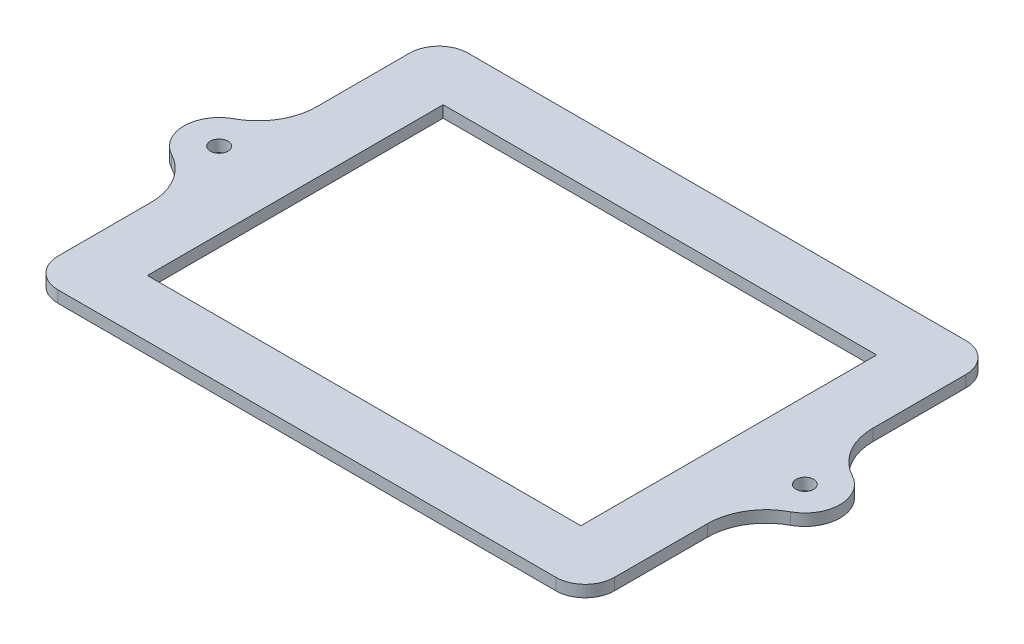
ISO-10303-21;
HEADER;
FILE_DESCRIPTION(('STEP AP214'),'2;1');
FILE_NAME('part.step','',(''),(''),'','','');
FILE_SCHEMA(('AUTOMOTIVE_DESIGN { 1 0 10303 214 1 1 1 1 }'));
ENDSEC;
DATA;
#1=APPLICATION_CONTEXT('core data for automotive mechanical design processes');
#2=APPLICATION_PROTOCOL_DEFINITION('international standard','automotive_design',2000,#1);
#3=PRODUCT_CONTEXT('',#1,'mechanical');
#4=PRODUCT('Part','Part','',(#3));
#5=PRODUCT_RELATED_PRODUCT_CATEGORY('part','',(#4));
#6=PRODUCT_DEFINITION_FORMATION('','',#4);
#7=PRODUCT_DEFINITION_CONTEXT('part definition',#1,'design');
#8=PRODUCT_DEFINITION('design','',#6,#7);
#9=PRODUCT_DEFINITION_SHAPE('','',#8);
#10=(LENGTH_UNIT() NAMED_UNIT(*) SI_UNIT(.MILLI.,.METRE.));
#11=(NAMED_UNIT(*) PLANE_ANGLE_UNIT() SI_UNIT($,.RADIAN.));
#12=(NAMED_UNIT(*) SI_UNIT($,.STERADIAN.) SOLID_ANGLE_UNIT());
#13=UNCERTAINTY_MEASURE_WITH_UNIT(LENGTH_MEASURE(1.E-05),#10,'distance_accuracy_value','');
#14=(GEOMETRIC_REPRESENTATION_CONTEXT(3) GLOBAL_UNCERTAINTY_ASSIGNED_CONTEXT((#13)) GLOBAL_UNIT_ASSIGNED_CONTEXT((#10,
#11,#12)) REPRESENTATION_CONTEXT('',''));
#15=CARTESIAN_POINT('',(0.,0.,0.));
#16=DIRECTION('',(0.,0.,1.));
#17=DIRECTION('',(1.,0.,0.));
#18=AXIS2_PLACEMENT_3D('',#15,#16,#17);
#19=CARTESIAN_POINT('',(-50.,2.,0.));
#20=DIRECTION('',(0.,1.,0.));
#21=DIRECTION('',(0.,0.,1.));
#22=AXIS2_PLACEMENT_3D('',#19,#20,#21);
#23=PLANE('',#22);
#24=CARTESIAN_POINT('',(-50.,2.,0.));
#25=DIRECTION('',(0.,1.,0.));
#26=DIRECTION('',(0.,0.,1.));
#27=AXIS2_PLACEMENT_3D('',#24,#25,#26);
#28=CIRCLE('',#27,1.5);
#29=CARTESIAN_POINT('',(-50.,2.,1.5));
#30=VERTEX_POINT('',#29);
#31=EDGE_CURVE('E204',#30,#30,#28,.T.);
#32=ORIENTED_EDGE('',*,*,#31,.F.);
#33=EDGE_LOOP('',(#32));
#34=FACE_BOUND('',#33,.T.);
#35=DIRECTION('',(1.,0.,0.));
#36=VECTOR('',#35,1.);
#37=CARTESIAN_POINT('',(-47.5,2.,35.));
#38=LINE('',#37,#36);
#39=CARTESIAN_POINT('',(-42.5,2.,35.));
#40=VERTEX_POINT('',#39);
#41=CARTESIAN_POINT('',(42.5,2.,35.));
#42=VERTEX_POINT('',#41);
#43=EDGE_CURVE('E224',#40,#42,#38,.T.);
#44=ORIENTED_EDGE('',*,*,#43,.T.);
#45=CARTESIAN_POINT('',(42.5,2.,30.));
#46=DIRECTION('',(0.,1.,0.));
#47=DIRECTION('',(0.,0.,1.));
#48=AXIS2_PLACEMENT_3D('',#45,#46,#47);
#49=CIRCLE('',#48,5.);
#50=CARTESIAN_POINT('',(47.5,2.,30.));
#51=VERTEX_POINT('',#50);
#52=EDGE_CURVE('E280',#42,#51,#49,.T.);
#53=ORIENTED_EDGE('',*,*,#52,.T.);
#54=DIRECTION('',(0.,0.,-1.));
#55=VECTOR('',#54,1.);
#56=CARTESIAN_POINT('',(47.5,2.,5.45435605731786));
#57=LINE('',#56,#55);
#58=CARTESIAN_POINT('',(47.5,2.,14.1332940251026));
#59=VERTEX_POINT('',#58);
#60=EDGE_CURVE('E227',#51,#59,#57,.T.);
#61=ORIENTED_EDGE('',*,*,#60,.T.);
#62=CARTESIAN_POINT('',(57.5,2.,14.1332940251026));
#63=DIRECTION('',(0.,1.,0.));
#64=DIRECTION('',(0.,0.,1.));
#65=AXIS2_PLACEMENT_3D('',#62,#63,#64);
#66=CIRCLE('',#65,10.);
#67=CARTESIAN_POINT('',(52.8125,2.,5.29998525941346));
#68=VERTEX_POINT('',#67);
#69=EDGE_CURVE('E11',#59,#68,#66,.F.);
#70=ORIENTED_EDGE('',*,*,#69,.T.);
#71=CARTESIAN_POINT('',(50.,2.,0.));
#72=DIRECTION('',(0.,1.,0.));
#73=DIRECTION('',(0.,0.,1.));
#74=AXIS2_PLACEMENT_3D('',#71,#72,#73);
#75=CIRCLE('',#74,6.);
#76=CARTESIAN_POINT('',(52.8125,2.,-5.29998525941346));
#77=VERTEX_POINT('',#76);
#78=EDGE_CURVE('E229',#68,#77,#75,.T.);
#79=ORIENTED_EDGE('',*,*,#78,.T.);
#80=CARTESIAN_POINT('',(57.5,2.,-14.1332940251026));
#81=DIRECTION('',(0.,1.,0.));
#82=DIRECTION('',(0.,0.,1.));
#83=AXIS2_PLACEMENT_3D('',#80,#81,#82);
#84=CIRCLE('',#83,10.);
#85=CARTESIAN_POINT('',(47.5,2.,-14.1332940251026));
#86=VERTEX_POINT('',#85);
#87=EDGE_CURVE('E325',#77,#86,#84,.F.);
#88=ORIENTED_EDGE('',*,*,#87,.T.);
#89=DIRECTION('',(0.,0.,-1.));
#90=VECTOR('',#89,1.);
#91=CARTESIAN_POINT('',(47.5,2.,-35.));
#92=LINE('',#91,#90);
#93=CARTESIAN_POINT('',(47.5,2.,-30.));
#94=VERTEX_POINT('',#93);
#95=EDGE_CURVE('E232',#86,#94,#92,.T.);
#96=ORIENTED_EDGE('',*,*,#95,.T.);
#97=CARTESIAN_POINT('',(42.5,2.,-30.));
#98=DIRECTION('',(0.,1.,0.));
#99=DIRECTION('',(0.,0.,1.));
#100=AXIS2_PLACEMENT_3D('',#97,#98,#99);
#101=CIRCLE('',#100,5.);
#102=CARTESIAN_POINT('',(42.5,2.,-35.));
#103=VERTEX_POINT('',#102);
#104=EDGE_CURVE('E274',#94,#103,#101,.T.);
#105=ORIENTED_EDGE('',*,*,#104,.T.);
#106=DIRECTION('',(-1.,0.,0.));
#107=VECTOR('',#106,1.);
#108=CARTESIAN_POINT('',(-47.5,2.,-35.));
#109=LINE('',#108,#107);
#110=CARTESIAN_POINT('',(-42.5,2.,-35.));
#111=VERTEX_POINT('',#110);
#112=EDGE_CURVE('E234',#103,#111,#109,.T.);
#113=ORIENTED_EDGE('',*,*,#112,.T.);
#114=CARTESIAN_POINT('',(-42.5,2.,-30.));
#115=DIRECTION('',(0.,1.,0.));
#116=DIRECTION('',(0.,0.,1.));
#117=AXIS2_PLACEMENT_3D('',#114,#115,#116);
#118=CIRCLE('',#117,5.);
#119=CARTESIAN_POINT('',(-47.5,2.,-30.));
#120=VERTEX_POINT('',#119);
#121=EDGE_CURVE('E276',#111,#120,#118,.T.);
#122=ORIENTED_EDGE('',*,*,#121,.T.);
#123=DIRECTION('',(0.,0.,1.));
#124=VECTOR('',#123,1.);
#125=CARTESIAN_POINT('',(-47.5,2.,-35.));
#126=LINE('',#125,#124);
#127=CARTESIAN_POINT('',(-47.5,2.,-14.1332940251026));
#128=VERTEX_POINT('',#127);
#129=EDGE_CURVE('E215',#120,#128,#126,.T.);
#130=ORIENTED_EDGE('',*,*,#129,.T.);
#131=CARTESIAN_POINT('',(-57.5,2.,-14.1332940251026));
#132=DIRECTION('',(0.,1.,0.));
#133=DIRECTION('',(0.,0.,1.));
#134=AXIS2_PLACEMENT_3D('',#131,#132,#133);
#135=CIRCLE('',#134,10.);
#136=CARTESIAN_POINT('',(-52.8125,2.,-5.29998525941346));
#137=VERTEX_POINT('',#136);
#138=EDGE_CURVE('E317',#128,#137,#135,.F.);
#139=ORIENTED_EDGE('',*,*,#138,.T.);
#140=CARTESIAN_POINT('',(-50.,2.,0.));
#141=DIRECTION('',(0.,1.,0.));
#142=DIRECTION('',(0.,0.,1.));
#143=AXIS2_PLACEMENT_3D('',#140,#141,#142);
#144=CIRCLE('',#143,6.);
#145=CARTESIAN_POINT('',(-52.8125,2.,5.29998525941346));
#146=VERTEX_POINT('',#145);
#147=EDGE_CURVE('E218',#137,#146,#144,.T.);
#148=ORIENTED_EDGE('',*,*,#147,.T.);
#149=CARTESIAN_POINT('',(-57.5,2.,14.1332940251026));
#150=DIRECTION('',(0.,1.,0.));
#151=DIRECTION('',(0.,0.,1.));
#152=AXIS2_PLACEMENT_3D('',#149,#150,#151);
#153=CIRCLE('',#152,10.);
#154=CARTESIAN_POINT('',(-47.5,2.,14.1332940251026));
#155=VERTEX_POINT('',#154);
#156=EDGE_CURVE('E321',#146,#155,#153,.F.);
#157=ORIENTED_EDGE('',*,*,#156,.T.);
#158=DIRECTION('',(0.,0.,1.));
#159=VECTOR('',#158,1.);
#160=CARTESIAN_POINT('',(-47.5,2.,5.45435605731786));
#161=LINE('',#160,#159);
#162=CARTESIAN_POINT('',(-47.5,2.,30.));
#163=VERTEX_POINT('',#162);
#164=EDGE_CURVE('E222',#155,#163,#161,.T.);
#165=ORIENTED_EDGE('',*,*,#164,.T.);
#166=CARTESIAN_POINT('',(-42.5,2.,30.));
#167=DIRECTION('',(0.,1.,0.));
#168=DIRECTION('',(0.,0.,1.));
#169=AXIS2_PLACEMENT_3D('',#166,#167,#168);
#170=CIRCLE('',#169,5.);
#171=EDGE_CURVE('E278',#163,#40,#170,.T.);
#172=ORIENTED_EDGE('',*,*,#171,.T.);
#173=EDGE_LOOP('',(#44,#53,#61,#70,#79,#88,#96,#105,#113,#122,#130,#139,#148,#157,#165,#172));
#174=FACE_BOUND('',#173,.T.);
#175=DIRECTION('',(1.,0.,0.));
#176=VECTOR('',#175,1.);
#177=CARTESIAN_POINT('',(-37.,2.,25.25));
#178=LINE('',#177,#176);
#179=CARTESIAN_POINT('',(-37.,2.,25.25));
#180=VERTEX_POINT('',#179);
#181=CARTESIAN_POINT('',(37.,2.,25.25));
#182=VERTEX_POINT('',#181);
#183=EDGE_CURVE('E181',#180,#182,#178,.T.);
#184=ORIENTED_EDGE('',*,*,#183,.F.);
#185=DIRECTION('',(0.,0.,1.));
#186=VECTOR('',#185,1.);
#187=CARTESIAN_POINT('',(-37.,2.,-25.25));
#188=LINE('',#187,#186);
#189=CARTESIAN_POINT('',(-37.,2.,-25.25));
#190=VERTEX_POINT('',#189);
#191=EDGE_CURVE('E171',#190,#180,#188,.T.);
#192=ORIENTED_EDGE('',*,*,#191,.F.);
#193=DIRECTION('',(-1.,0.,0.));
#194=VECTOR('',#193,1.);
#195=CARTESIAN_POINT('',(-37.,2.,-25.25));
#196=LINE('',#195,#194);
#197=CARTESIAN_POINT('',(37.,2.,-25.25));
#198=VERTEX_POINT('',#197);
#199=EDGE_CURVE('E197',#198,#190,#196,.T.);
#200=ORIENTED_EDGE('',*,*,#199,.F.);
#201=DIRECTION('',(0.,0.,-1.));
#202=VECTOR('',#201,1.);
#203=CARTESIAN_POINT('',(37.,2.,-25.25));
#204=LINE('',#203,#202);
#205=EDGE_CURVE('E195',#182,#198,#204,.T.);
#206=ORIENTED_EDGE('',*,*,#205,.F.);
#207=EDGE_LOOP('',(#184,#192,#200,#206));
#208=FACE_BOUND('',#207,.T.);
#209=CARTESIAN_POINT('',(50.,2.,0.));
#210=DIRECTION('',(0.,1.,0.));
#211=DIRECTION('',(0.,0.,1.));
#212=AXIS2_PLACEMENT_3D('',#209,#210,#211);
#213=CIRCLE('',#212,1.5);
#214=CARTESIAN_POINT('',(50.,2.,1.5));
#215=VERTEX_POINT('',#214);
#216=EDGE_CURVE('E598',#215,#215,#213,.T.);
#217=ORIENTED_EDGE('',*,*,#216,.F.);
#218=EDGE_LOOP('',(#217));
#219=FACE_BOUND('',#218,.T.);
#220=ADVANCED_FACE('F33',(#34,#174,#208,#219),#23,.T.);
#221=CARTESIAN_POINT('',(-50.,0.,0.));
#222=DIRECTION('',(0.,1.,0.));
#223=DIRECTION('',(0.,0.,1.));
#224=AXIS2_PLACEMENT_3D('',#221,#222,#223);
#225=PLANE('',#224);
#226=DIRECTION('',(0.,0.,-1.));
#227=VECTOR('',#226,1.);
#228=CARTESIAN_POINT('',(47.5,0.,5.45435605731786));
#229=LINE('',#228,#227);
#230=CARTESIAN_POINT('',(47.5,0.,30.));
#231=VERTEX_POINT('',#230);
#232=CARTESIAN_POINT('',(47.5,0.,14.1332940251026));
#233=VERTEX_POINT('',#232);
#234=EDGE_CURVE('E248',#231,#233,#229,.T.);
#235=ORIENTED_EDGE('',*,*,#234,.F.);
#236=CARTESIAN_POINT('',(42.5,0.,30.));
#237=DIRECTION('',(0.,1.,0.));
#238=DIRECTION('',(0.,0.,1.));
#239=AXIS2_PLACEMENT_3D('',#236,#237,#238);
#240=CIRCLE('',#239,5.);
#241=CARTESIAN_POINT('',(42.5,0.,35.));
#242=VERTEX_POINT('',#241);
#243=EDGE_CURVE('E267',#231,#242,#240,.F.);
#244=ORIENTED_EDGE('',*,*,#243,.T.);
#245=DIRECTION('',(1.,0.,0.));
#246=VECTOR('',#245,1.);
#247=CARTESIAN_POINT('',(-47.5,0.,35.));
#248=LINE('',#247,#246);
#249=CARTESIAN_POINT('',(-42.5,0.,35.));
#250=VERTEX_POINT('',#249);
#251=EDGE_CURVE('E245',#250,#242,#248,.T.);
#252=ORIENTED_EDGE('',*,*,#251,.F.);
#253=CARTESIAN_POINT('',(-42.5,0.,30.));
#254=DIRECTION('',(0.,1.,0.));
#255=DIRECTION('',(0.,0.,1.));
#256=AXIS2_PLACEMENT_3D('',#253,#254,#255);
#257=CIRCLE('',#256,5.);
#258=CARTESIAN_POINT('',(-47.5,0.,30.));
#259=VERTEX_POINT('',#258);
#260=EDGE_CURVE('E264',#250,#259,#257,.F.);
#261=ORIENTED_EDGE('',*,*,#260,.T.);
#262=DIRECTION('',(0.,0.,1.));
#263=VECTOR('',#262,1.);
#264=CARTESIAN_POINT('',(-47.5,0.,5.45435605731786));
#265=LINE('',#264,#263);
#266=CARTESIAN_POINT('',(-47.5,0.,14.1332940251026));
#267=VERTEX_POINT('',#266);
#268=EDGE_CURVE('E243',#267,#259,#265,.T.);
#269=ORIENTED_EDGE('',*,*,#268,.F.);
#270=CARTESIAN_POINT('',(-57.5,0.,14.1332940251026));
#271=DIRECTION('',(0.,1.,0.));
#272=DIRECTION('',(0.,0.,1.));
#273=AXIS2_PLACEMENT_3D('',#270,#271,#272);
#274=CIRCLE('',#273,10.);
#275=CARTESIAN_POINT('',(-52.8125,0.,5.29998525941346));
#276=VERTEX_POINT('',#275);
#277=EDGE_CURVE('E319',#267,#276,#274,.T.);
#278=ORIENTED_EDGE('',*,*,#277,.T.);
#279=CARTESIAN_POINT('',(-50.,0.,0.));
#280=DIRECTION('',(0.,1.,0.));
#281=DIRECTION('',(0.,0.,1.));
#282=AXIS2_PLACEMENT_3D('',#279,#280,#281);
#283=CIRCLE('',#282,6.);
#284=CARTESIAN_POINT('',(-52.8125,0.,-5.29998525941346));
#285=VERTEX_POINT('',#284);
#286=EDGE_CURVE('E240',#285,#276,#283,.T.);
#287=ORIENTED_EDGE('',*,*,#286,.F.);
#288=CARTESIAN_POINT('',(-57.5,0.,-14.1332940251026));
#289=DIRECTION('',(0.,1.,0.));
#290=DIRECTION('',(0.,0.,1.));
#291=AXIS2_PLACEMENT_3D('',#288,#289,#290);
#292=CIRCLE('',#291,10.);
#293=CARTESIAN_POINT('',(-47.5,0.,-14.1332940251026));
#294=VERTEX_POINT('',#293);
#295=EDGE_CURVE('E315',#285,#294,#292,.T.);
#296=ORIENTED_EDGE('',*,*,#295,.T.);
#297=DIRECTION('',(0.,0.,1.));
#298=VECTOR('',#297,1.);
#299=CARTESIAN_POINT('',(-47.5,0.,-35.));
#300=LINE('',#299,#298);
#301=CARTESIAN_POINT('',(-47.5,0.,-30.));
#302=VERTEX_POINT('',#301);
#303=EDGE_CURVE('E189',#302,#294,#300,.T.);
#304=ORIENTED_EDGE('',*,*,#303,.F.);
#305=CARTESIAN_POINT('',(-42.5,0.,-30.));
#306=DIRECTION('',(0.,1.,0.));
#307=DIRECTION('',(0.,0.,1.));
#308=AXIS2_PLACEMENT_3D('',#305,#306,#307);
#309=CIRCLE('',#308,5.);
#310=CARTESIAN_POINT('',(-42.5,0.,-35.));
#311=VERTEX_POINT('',#310);
#312=EDGE_CURVE('E262',#302,#311,#309,.F.);
#313=ORIENTED_EDGE('',*,*,#312,.T.);
#314=DIRECTION('',(-1.,0.,0.));
#315=VECTOR('',#314,1.);
#316=CARTESIAN_POINT('',(-47.5,0.,-35.));
#317=LINE('',#316,#315);
#318=CARTESIAN_POINT('',(42.5,0.,-35.));
#319=VERTEX_POINT('',#318);
#320=EDGE_CURVE('E219',#319,#311,#317,.T.);
#321=ORIENTED_EDGE('',*,*,#320,.F.);
#322=CARTESIAN_POINT('',(42.5,0.,-30.));
#323=DIRECTION('',(0.,1.,0.));
#324=DIRECTION('',(0.,0.,1.));
#325=AXIS2_PLACEMENT_3D('',#322,#323,#324);
#326=CIRCLE('',#325,5.);
#327=CARTESIAN_POINT('',(47.5,0.,-30.));
#328=VERTEX_POINT('',#327);
#329=EDGE_CURVE('E259',#319,#328,#326,.F.);
#330=ORIENTED_EDGE('',*,*,#329,.T.);
#331=DIRECTION('',(0.,0.,-1.));
#332=VECTOR('',#331,1.);
#333=CARTESIAN_POINT('',(47.5,0.,-35.));
#334=LINE('',#333,#332);
#335=CARTESIAN_POINT('',(47.5,0.,-14.1332940251026));
#336=VERTEX_POINT('',#335);
#337=EDGE_CURVE('E253',#336,#328,#334,.T.);
#338=ORIENTED_EDGE('',*,*,#337,.F.);
#339=CARTESIAN_POINT('',(57.5,0.,-14.1332940251026));
#340=DIRECTION('',(0.,1.,0.));
#341=DIRECTION('',(0.,0.,1.));
#342=AXIS2_PLACEMENT_3D('',#339,#340,#341);
#343=CIRCLE('',#342,10.);
#344=CARTESIAN_POINT('',(52.8125,0.,-5.29998525941346));
#345=VERTEX_POINT('',#344);
#346=EDGE_CURVE('E323',#336,#345,#343,.T.);
#347=ORIENTED_EDGE('',*,*,#346,.T.);
#348=CARTESIAN_POINT('',(50.,0.,0.));
#349=DIRECTION('',(0.,1.,0.));
#350=DIRECTION('',(0.,0.,1.));
#351=AXIS2_PLACEMENT_3D('',#348,#349,#350);
#352=CIRCLE('',#351,6.);
#353=CARTESIAN_POINT('',(52.8125,0.,5.29998525941346));
#354=VERTEX_POINT('',#353);
#355=EDGE_CURVE('E250',#354,#345,#352,.T.);
#356=ORIENTED_EDGE('',*,*,#355,.F.);
#357=CARTESIAN_POINT('',(57.5,0.,14.1332940251026));
#358=DIRECTION('',(0.,1.,0.));
#359=DIRECTION('',(0.,0.,1.));
#360=AXIS2_PLACEMENT_3D('',#357,#358,#359);
#361=CIRCLE('',#360,10.);
#362=EDGE_CURVE('E41',#354,#233,#361,.T.);
#363=ORIENTED_EDGE('',*,*,#362,.T.);
#364=EDGE_LOOP('',(#235,#244,#252,#261,#269,#278,#287,#296,#304,#313,#321,#330,#338,#347,#356,#363));
#365=FACE_BOUND('',#364,.T.);
#366=DIRECTION('',(0.,0.,1.));
#367=VECTOR('',#366,1.);
#368=CARTESIAN_POINT('',(-37.,0.,-25.25));
#369=LINE('',#368,#367);
#370=CARTESIAN_POINT('',(-37.,0.,-25.25));
#371=VERTEX_POINT('',#370);
#372=CARTESIAN_POINT('',(-37.,0.,25.25));
#373=VERTEX_POINT('',#372);
#374=EDGE_CURVE('E202',#371,#373,#369,.T.);
#375=ORIENTED_EDGE('',*,*,#374,.T.);
#376=DIRECTION('',(1.,0.,0.));
#377=VECTOR('',#376,1.);
#378=CARTESIAN_POINT('',(-37.,0.,25.25));
#379=LINE('',#378,#377);
#380=CARTESIAN_POINT('',(37.,0.,25.25));
#381=VERTEX_POINT('',#380);
#382=EDGE_CURVE('E188',#373,#381,#379,.T.);
#383=ORIENTED_EDGE('',*,*,#382,.T.);
#384=DIRECTION('',(0.,0.,-1.));
#385=VECTOR('',#384,1.);
#386=CARTESIAN_POINT('',(37.,0.,-25.25));
#387=LINE('',#386,#385);
#388=CARTESIAN_POINT('',(37.,0.,-25.25));
#389=VERTEX_POINT('',#388);
#390=EDGE_CURVE('E206',#381,#389,#387,.T.);
#391=ORIENTED_EDGE('',*,*,#390,.T.);
#392=DIRECTION('',(-1.,0.,0.));
#393=VECTOR('',#392,1.);
#394=CARTESIAN_POINT('',(-37.,0.,-25.25));
#395=LINE('',#394,#393);
#396=EDGE_CURVE('E182',#389,#371,#395,.T.);
#397=ORIENTED_EDGE('',*,*,#396,.T.);
#398=EDGE_LOOP('',(#375,#383,#391,#397));
#399=FACE_BOUND('',#398,.T.);
#400=CARTESIAN_POINT('',(-50.,0.,0.));
#401=DIRECTION('',(0.,1.,0.));
#402=DIRECTION('',(0.,0.,1.));
#403=AXIS2_PLACEMENT_3D('',#400,#401,#402);
#404=CIRCLE('',#403,1.5);
#405=CARTESIAN_POINT('',(-50.,0.,1.5));
#406=VERTEX_POINT('',#405);
#407=EDGE_CURVE('E604',#406,#406,#404,.T.);
#408=ORIENTED_EDGE('',*,*,#407,.T.);
#409=EDGE_LOOP('',(#408));
#410=FACE_BOUND('',#409,.T.);
#411=CARTESIAN_POINT('',(50.,0.,0.));
#412=DIRECTION('',(0.,1.,0.));
#413=DIRECTION('',(0.,0.,1.));
#414=AXIS2_PLACEMENT_3D('',#411,#412,#413);
#415=CIRCLE('',#414,1.5);
#416=CARTESIAN_POINT('',(50.,0.,1.5));
#417=VERTEX_POINT('',#416);
#418=EDGE_CURVE('E601',#417,#417,#415,.T.);
#419=ORIENTED_EDGE('',*,*,#418,.T.);
#420=EDGE_LOOP('',(#419));
#421=FACE_BOUND('',#420,.T.);
#422=ADVANCED_FACE('F339',(#365,#399,#410,#421),#225,.F.);
#423=CARTESIAN_POINT('',(-47.5,2.,-35.));
#424=DIRECTION('',(1.,0.,0.));
#425=DIRECTION('',(0.,0.,-1.));
#426=AXIS2_PLACEMENT_3D('',#423,#424,#425);
#427=PLANE('',#426);
#428=ORIENTED_EDGE('',*,*,#303,.T.);
#429=DIRECTION('',(0.,1.,0.));
#430=VECTOR('',#429,1.);
#431=CARTESIAN_POINT('',(-47.5,2.,-14.1332940251026));
#432=LINE('',#431,#430);
#433=EDGE_CURVE('E301',#294,#128,#432,.T.);
#434=ORIENTED_EDGE('',*,*,#433,.T.);
#435=ORIENTED_EDGE('',*,*,#129,.F.);
#436=DIRECTION('',(0.,-1.,0.));
#437=VECTOR('',#436,1.);
#438=CARTESIAN_POINT('',(-47.5,2.,-30.));
#439=LINE('',#438,#437);
#440=EDGE_CURVE('E285',#120,#302,#439,.T.);
#441=ORIENTED_EDGE('',*,*,#440,.T.);
#442=EDGE_LOOP('',(#428,#434,#435,#441));
#443=FACE_BOUND('',#442,.T.);
#444=ADVANCED_FACE('F382',(#443),#427,.F.);
#445=CARTESIAN_POINT('',(-50.,2.,0.));
#446=DIRECTION('',(0.,-1.,0.));
#447=DIRECTION('',(0.,0.,-1.));
#448=AXIS2_PLACEMENT_3D('',#445,#446,#447);
#449=CYLINDRICAL_SURFACE('',#448,6.);
#450=ORIENTED_EDGE('',*,*,#147,.F.);
#451=DIRECTION('',(0.,-1.,0.));
#452=VECTOR('',#451,1.);
#453=CARTESIAN_POINT('',(-52.8125,2.,-5.29998525941346));
#454=LINE('',#453,#452);
#455=EDGE_CURVE('E298',#137,#285,#454,.T.);
#456=ORIENTED_EDGE('',*,*,#455,.T.);
#457=ORIENTED_EDGE('',*,*,#286,.T.);
#458=DIRECTION('',(0.,-1.,0.));
#459=VECTOR('',#458,1.);
#460=CARTESIAN_POINT('',(-52.8125,2.,5.29998525941346));
#461=LINE('',#460,#459);
#462=EDGE_CURVE('E296',#276,#146,#461,.F.);
#463=ORIENTED_EDGE('',*,*,#462,.T.);
#464=EDGE_LOOP('',(#450,#456,#457,#463));
#465=FACE_BOUND('',#464,.T.);
#466=ADVANCED_FACE('F373',(#465),#449,.T.);
#467=CARTESIAN_POINT('',(-47.5,2.,5.45435605731786));
#468=DIRECTION('',(1.,0.,0.));
#469=DIRECTION('',(0.,0.,-1.));
#470=AXIS2_PLACEMENT_3D('',#467,#468,#469);
#471=PLANE('',#470);
#472=ORIENTED_EDGE('',*,*,#164,.F.);
#473=DIRECTION('',(0.,1.,0.));
#474=VECTOR('',#473,1.);
#475=CARTESIAN_POINT('',(-47.5,0.,14.1332940251026));
#476=LINE('',#475,#474);
#477=EDGE_CURVE('E303',#155,#267,#476,.F.);
#478=ORIENTED_EDGE('',*,*,#477,.T.);
#479=ORIENTED_EDGE('',*,*,#268,.T.);
#480=DIRECTION('',(0.,-1.,0.));
#481=VECTOR('',#480,1.);
#482=CARTESIAN_POINT('',(-47.5,2.,30.));
#483=LINE('',#482,#481);
#484=EDGE_CURVE('E282',#259,#163,#483,.F.);
#485=ORIENTED_EDGE('',*,*,#484,.T.);
#486=EDGE_LOOP('',(#472,#478,#479,#485));
#487=FACE_BOUND('',#486,.T.);
#488=ADVANCED_FACE('F365',(#487),#471,.F.);
#489=CARTESIAN_POINT('',(-47.5,2.,35.));
#490=DIRECTION('',(0.,0.,-1.));
#491=DIRECTION('',(-1.,0.,0.));
#492=AXIS2_PLACEMENT_3D('',#489,#490,#491);
#493=PLANE('',#492);
#494=ORIENTED_EDGE('',*,*,#251,.T.);
#495=DIRECTION('',(0.,-1.,0.));
#496=VECTOR('',#495,1.);
#497=CARTESIAN_POINT('',(42.5,2.,35.));
#498=LINE('',#497,#496);
#499=EDGE_CURVE('E272',#242,#42,#498,.F.);
#500=ORIENTED_EDGE('',*,*,#499,.T.);
#501=ORIENTED_EDGE('',*,*,#43,.F.);
#502=DIRECTION('',(0.,-1.,0.));
#503=VECTOR('',#502,1.);
#504=CARTESIAN_POINT('',(-42.5,2.,35.));
#505=LINE('',#504,#503);
#506=EDGE_CURVE('E269',#40,#250,#505,.T.);
#507=ORIENTED_EDGE('',*,*,#506,.T.);
#508=EDGE_LOOP('',(#494,#500,#501,#507));
#509=FACE_BOUND('',#508,.T.);
#510=ADVANCED_FACE('F354',(#509),#493,.F.);
#511=CARTESIAN_POINT('',(47.5,2.,5.45435605731786));
#512=DIRECTION('',(-1.,0.,0.));
#513=DIRECTION('',(0.,0.,1.));
#514=AXIS2_PLACEMENT_3D('',#511,#512,#513);
#515=PLANE('',#514);
#516=ORIENTED_EDGE('',*,*,#234,.T.);
#517=DIRECTION('',(0.,1.,0.));
#518=VECTOR('',#517,1.);
#519=CARTESIAN_POINT('',(47.5,2.,14.1332940251026));
#520=LINE('',#519,#518);
#521=EDGE_CURVE('E54',#233,#59,#520,.T.);
#522=ORIENTED_EDGE('',*,*,#521,.T.);
#523=ORIENTED_EDGE('',*,*,#60,.F.);
#524=DIRECTION('',(0.,-1.,0.));
#525=VECTOR('',#524,1.);
#526=CARTESIAN_POINT('',(47.5,2.,30.));
#527=LINE('',#526,#525);
#528=EDGE_CURVE('E237',#51,#231,#527,.T.);
#529=ORIENTED_EDGE('',*,*,#528,.T.);
#530=EDGE_LOOP('',(#516,#522,#523,#529));
#531=FACE_BOUND('',#530,.T.);
#532=ADVANCED_FACE('F348',(#531),#515,.F.);
#533=CARTESIAN_POINT('',(50.,2.,0.));
#534=DIRECTION('',(0.,-1.,0.));
#535=DIRECTION('',(0.,0.,-1.));
#536=AXIS2_PLACEMENT_3D('',#533,#534,#535);
#537=CYLINDRICAL_SURFACE('',#536,6.);
#538=ORIENTED_EDGE('',*,*,#355,.T.);
#539=DIRECTION('',(0.,-1.,0.));
#540=VECTOR('',#539,1.);
#541=CARTESIAN_POINT('',(52.8125,2.,-5.29998525941346));
#542=LINE('',#541,#540);
#543=EDGE_CURVE('E312',#345,#77,#542,.F.);
#544=ORIENTED_EDGE('',*,*,#543,.T.);
#545=ORIENTED_EDGE('',*,*,#78,.F.);
#546=DIRECTION('',(0.,-1.,0.));
#547=VECTOR('',#546,1.);
#548=CARTESIAN_POINT('',(52.8125,2.,5.29998525941346));
#549=LINE('',#548,#547);
#550=EDGE_CURVE('E309',#68,#354,#549,.T.);
#551=ORIENTED_EDGE('',*,*,#550,.T.);
#552=EDGE_LOOP('',(#538,#544,#545,#551));
#553=FACE_BOUND('',#552,.T.);
#554=ADVANCED_FACE('F342',(#553),#537,.T.);
#555=CARTESIAN_POINT('',(47.5,2.,-35.));
#556=DIRECTION('',(-1.,0.,0.));
#557=DIRECTION('',(0.,0.,1.));
#558=AXIS2_PLACEMENT_3D('',#555,#556,#557);
#559=PLANE('',#558);
#560=ORIENTED_EDGE('',*,*,#95,.F.);
#561=DIRECTION('',(0.,1.,0.));
#562=VECTOR('',#561,1.);
#563=CARTESIAN_POINT('',(47.5,0.,-14.1332940251026));
#564=LINE('',#563,#562);
#565=EDGE_CURVE('E306',#86,#336,#564,.F.);
#566=ORIENTED_EDGE('',*,*,#565,.T.);
#567=ORIENTED_EDGE('',*,*,#337,.T.);
#568=DIRECTION('',(0.,-1.,0.));
#569=VECTOR('',#568,1.);
#570=CARTESIAN_POINT('',(47.5,2.,-30.));
#571=LINE('',#570,#569);
#572=EDGE_CURVE('E293',#328,#94,#571,.F.);
#573=ORIENTED_EDGE('',*,*,#572,.T.);
#574=EDGE_LOOP('',(#560,#566,#567,#573));
#575=FACE_BOUND('',#574,.T.);
#576=ADVANCED_FACE('F334',(#575),#559,.F.);
#577=CARTESIAN_POINT('',(-47.5,2.,-35.));
#578=DIRECTION('',(0.,0.,1.));
#579=DIRECTION('',(1.,0.,0.));
#580=AXIS2_PLACEMENT_3D('',#577,#578,#579);
#581=PLANE('',#580);
#582=ORIENTED_EDGE('',*,*,#320,.T.);
#583=DIRECTION('',(0.,-1.,0.));
#584=VECTOR('',#583,1.);
#585=CARTESIAN_POINT('',(-42.5,2.,-35.));
#586=LINE('',#585,#584);
#587=EDGE_CURVE('E291',#311,#111,#586,.F.);
#588=ORIENTED_EDGE('',*,*,#587,.T.);
#589=ORIENTED_EDGE('',*,*,#112,.F.);
#590=DIRECTION('',(0.,-1.,0.));
#591=VECTOR('',#590,1.);
#592=CARTESIAN_POINT('',(42.5,2.,-35.));
#593=LINE('',#592,#591);
#594=EDGE_CURVE('E288',#103,#319,#593,.T.);
#595=ORIENTED_EDGE('',*,*,#594,.T.);
#596=EDGE_LOOP('',(#582,#588,#589,#595));
#597=FACE_BOUND('',#596,.T.);
#598=ADVANCED_FACE('F390',(#597),#581,.F.);
#599=CARTESIAN_POINT('',(-37.,2.,-25.25));
#600=DIRECTION('',(1.,0.,0.));
#601=DIRECTION('',(0.,0.,-1.));
#602=AXIS2_PLACEMENT_3D('',#599,#600,#601);
#603=PLANE('',#602);
#604=ORIENTED_EDGE('',*,*,#374,.F.);
#605=DIRECTION('',(0.,-1.,0.));
#606=VECTOR('',#605,1.);
#607=CARTESIAN_POINT('',(-37.,2.,-25.25));
#608=LINE('',#607,#606);
#609=EDGE_CURVE('E177',#190,#371,#608,.T.);
#610=ORIENTED_EDGE('',*,*,#609,.F.);
#611=ORIENTED_EDGE('',*,*,#191,.T.);
#612=DIRECTION('',(0.,-1.,0.));
#613=VECTOR('',#612,1.);
#614=CARTESIAN_POINT('',(-37.,2.,25.25));
#615=LINE('',#614,#613);
#616=EDGE_CURVE('E174',#180,#373,#615,.T.);
#617=ORIENTED_EDGE('',*,*,#616,.T.);
#618=EDGE_LOOP('',(#604,#610,#611,#617));
#619=FACE_BOUND('',#618,.T.);
#620=ADVANCED_FACE('F173',(#619),#603,.T.);
#621=CARTESIAN_POINT('',(-37.,2.,25.25));
#622=DIRECTION('',(0.,0.,-1.));
#623=DIRECTION('',(-1.,0.,0.));
#624=AXIS2_PLACEMENT_3D('',#621,#622,#623);
#625=PLANE('',#624);
#626=ORIENTED_EDGE('',*,*,#382,.F.);
#627=ORIENTED_EDGE('',*,*,#616,.F.);
#628=ORIENTED_EDGE('',*,*,#183,.T.);
#629=DIRECTION('',(0.,-1.,0.));
#630=VECTOR('',#629,1.);
#631=CARTESIAN_POINT('',(37.,2.,25.25));
#632=LINE('',#631,#630);
#633=EDGE_CURVE('E190',#182,#381,#632,.T.);
#634=ORIENTED_EDGE('',*,*,#633,.T.);
#635=EDGE_LOOP('',(#626,#627,#628,#634));
#636=FACE_BOUND('',#635,.T.);
#637=ADVANCED_FACE('F185',(#636),#625,.T.);
#638=CARTESIAN_POINT('',(37.,2.,-25.25));
#639=DIRECTION('',(-1.,0.,0.));
#640=DIRECTION('',(0.,0.,1.));
#641=AXIS2_PLACEMENT_3D('',#638,#639,#640);
#642=PLANE('',#641);
#643=ORIENTED_EDGE('',*,*,#390,.F.);
#644=ORIENTED_EDGE('',*,*,#633,.F.);
#645=ORIENTED_EDGE('',*,*,#205,.T.);
#646=DIRECTION('',(0.,-1.,0.));
#647=VECTOR('',#646,1.);
#648=CARTESIAN_POINT('',(37.,2.,-25.25));
#649=LINE('',#648,#647);
#650=EDGE_CURVE('E212',#198,#389,#649,.T.);
#651=ORIENTED_EDGE('',*,*,#650,.T.);
#652=EDGE_LOOP('',(#643,#644,#645,#651));
#653=FACE_BOUND('',#652,.T.);
#654=ADVANCED_FACE('F540',(#653),#642,.T.);
#655=CARTESIAN_POINT('',(-37.,2.,-25.25));
#656=DIRECTION('',(0.,0.,1.));
#657=DIRECTION('',(1.,0.,0.));
#658=AXIS2_PLACEMENT_3D('',#655,#656,#657);
#659=PLANE('',#658);
#660=ORIENTED_EDGE('',*,*,#396,.F.);
#661=ORIENTED_EDGE('',*,*,#650,.F.);
#662=ORIENTED_EDGE('',*,*,#199,.T.);
#663=ORIENTED_EDGE('',*,*,#609,.T.);
#664=EDGE_LOOP('',(#660,#661,#662,#663));
#665=FACE_BOUND('',#664,.T.);
#666=ADVANCED_FACE('F546',(#665),#659,.T.);
#667=CARTESIAN_POINT('',(-50.,2.,0.));
#668=DIRECTION('',(0.,-1.,0.));
#669=DIRECTION('',(0.,0.,-1.));
#670=AXIS2_PLACEMENT_3D('',#667,#668,#669);
#671=CYLINDRICAL_SURFACE('',#670,1.5);
#672=ORIENTED_EDGE('',*,*,#31,.T.);
#673=EDGE_LOOP('',(#672));
#674=FACE_BOUND('',#673,.T.);
#675=ORIENTED_EDGE('',*,*,#407,.F.);
#676=EDGE_LOOP('',(#675));
#677=FACE_BOUND('',#676,.T.);
#678=ADVANCED_FACE('F554',(#674,#677),#671,.F.);
#679=CARTESIAN_POINT('',(50.,2.,0.));
#680=DIRECTION('',(0.,-1.,0.));
#681=DIRECTION('',(0.,0.,-1.));
#682=AXIS2_PLACEMENT_3D('',#679,#680,#681);
#683=CYLINDRICAL_SURFACE('',#682,1.5);
#684=ORIENTED_EDGE('',*,*,#216,.T.);
#685=EDGE_LOOP('',(#684));
#686=FACE_BOUND('',#685,.T.);
#687=ORIENTED_EDGE('',*,*,#418,.F.);
#688=EDGE_LOOP('',(#687));
#689=FACE_BOUND('',#688,.T.);
#690=ADVANCED_FACE('F432',(#686,#689),#683,.F.);
#691=CARTESIAN_POINT('',(42.5,2.,30.));
#692=DIRECTION('',(0.,-1.,0.));
#693=DIRECTION('',(0.,0.,-1.));
#694=AXIS2_PLACEMENT_3D('',#691,#692,#693);
#695=CYLINDRICAL_SURFACE('',#694,5.);
#696=ORIENTED_EDGE('',*,*,#52,.F.);
#697=ORIENTED_EDGE('',*,*,#499,.F.);
#698=ORIENTED_EDGE('',*,*,#243,.F.);
#699=ORIENTED_EDGE('',*,*,#528,.F.);
#700=EDGE_LOOP('',(#696,#697,#698,#699));
#701=FACE_BOUND('',#700,.T.);
#702=ADVANCED_FACE('F350',(#701),#695,.T.);
#703=CARTESIAN_POINT('',(-42.5,2.,30.));
#704=DIRECTION('',(0.,-1.,0.));
#705=DIRECTION('',(0.,0.,-1.));
#706=AXIS2_PLACEMENT_3D('',#703,#704,#705);
#707=CYLINDRICAL_SURFACE('',#706,5.);
#708=ORIENTED_EDGE('',*,*,#171,.F.);
#709=ORIENTED_EDGE('',*,*,#484,.F.);
#710=ORIENTED_EDGE('',*,*,#260,.F.);
#711=ORIENTED_EDGE('',*,*,#506,.F.);
#712=EDGE_LOOP('',(#708,#709,#710,#711));
#713=FACE_BOUND('',#712,.T.);
#714=ADVANCED_FACE('F359',(#713),#707,.T.);
#715=CARTESIAN_POINT('',(-42.5,2.,-30.));
#716=DIRECTION('',(0.,-1.,0.));
#717=DIRECTION('',(0.,0.,-1.));
#718=AXIS2_PLACEMENT_3D('',#715,#716,#717);
#719=CYLINDRICAL_SURFACE('',#718,5.);
#720=ORIENTED_EDGE('',*,*,#121,.F.);
#721=ORIENTED_EDGE('',*,*,#587,.F.);
#722=ORIENTED_EDGE('',*,*,#312,.F.);
#723=ORIENTED_EDGE('',*,*,#440,.F.);
#724=EDGE_LOOP('',(#720,#721,#722,#723));
#725=FACE_BOUND('',#724,.T.);
#726=ADVANCED_FACE('F386',(#725),#719,.T.);
#727=CARTESIAN_POINT('',(42.5,2.,-30.));
#728=DIRECTION('',(0.,-1.,0.));
#729=DIRECTION('',(0.,0.,-1.));
#730=AXIS2_PLACEMENT_3D('',#727,#728,#729);
#731=CYLINDRICAL_SURFACE('',#730,5.);
#732=ORIENTED_EDGE('',*,*,#104,.F.);
#733=ORIENTED_EDGE('',*,*,#572,.F.);
#734=ORIENTED_EDGE('',*,*,#329,.F.);
#735=ORIENTED_EDGE('',*,*,#594,.F.);
#736=EDGE_LOOP('',(#732,#733,#734,#735));
#737=FACE_BOUND('',#736,.T.);
#738=ADVANCED_FACE('F394',(#737),#731,.T.);
#739=CARTESIAN_POINT('',(-57.5,2.,-14.1332940251026));
#740=DIRECTION('',(0.,-1.,0.));
#741=DIRECTION('',(0.,0.,-1.));
#742=AXIS2_PLACEMENT_3D('',#739,#740,#741);
#743=CYLINDRICAL_SURFACE('',#742,10.);
#744=ORIENTED_EDGE('',*,*,#138,.F.);
#745=ORIENTED_EDGE('',*,*,#433,.F.);
#746=ORIENTED_EDGE('',*,*,#295,.F.);
#747=ORIENTED_EDGE('',*,*,#455,.F.);
#748=EDGE_LOOP('',(#744,#745,#746,#747));
#749=FACE_BOUND('',#748,.T.);
#750=ADVANCED_FACE('F379',(#749),#743,.F.);
#751=CARTESIAN_POINT('',(-57.5,2.,14.1332940251026));
#752=DIRECTION('',(0.,-1.,0.));
#753=DIRECTION('',(0.,0.,-1.));
#754=AXIS2_PLACEMENT_3D('',#751,#752,#753);
#755=CYLINDRICAL_SURFACE('',#754,10.);
#756=ORIENTED_EDGE('',*,*,#156,.F.);
#757=ORIENTED_EDGE('',*,*,#462,.F.);
#758=ORIENTED_EDGE('',*,*,#277,.F.);
#759=ORIENTED_EDGE('',*,*,#477,.F.);
#760=EDGE_LOOP('',(#756,#757,#758,#759));
#761=FACE_BOUND('',#760,.T.);
#762=ADVANCED_FACE('F369',(#761),#755,.F.);
#763=CARTESIAN_POINT('',(57.5,2.,-14.1332940251026));
#764=DIRECTION('',(0.,-1.,0.));
#765=DIRECTION('',(0.,0.,-1.));
#766=AXIS2_PLACEMENT_3D('',#763,#764,#765);
#767=CYLINDRICAL_SURFACE('',#766,10.);
#768=ORIENTED_EDGE('',*,*,#87,.F.);
#769=ORIENTED_EDGE('',*,*,#543,.F.);
#770=ORIENTED_EDGE('',*,*,#346,.F.);
#771=ORIENTED_EDGE('',*,*,#565,.F.);
#772=EDGE_LOOP('',(#768,#769,#770,#771));
#773=FACE_BOUND('',#772,.T.);
#774=ADVANCED_FACE('F338',(#773),#767,.F.);
#775=CARTESIAN_POINT('',(57.5,2.,14.1332940251026));
#776=DIRECTION('',(0.,-1.,0.));
#777=DIRECTION('',(0.,0.,-1.));
#778=AXIS2_PLACEMENT_3D('',#775,#776,#777);
#779=CYLINDRICAL_SURFACE('',#778,10.);
#780=ORIENTED_EDGE('',*,*,#69,.F.);
#781=ORIENTED_EDGE('',*,*,#521,.F.);
#782=ORIENTED_EDGE('',*,*,#362,.F.);
#783=ORIENTED_EDGE('',*,*,#550,.F.);
#784=EDGE_LOOP('',(#780,#781,#782,#783));
#785=FACE_BOUND('',#784,.T.);
#786=ADVANCED_FACE('F35',(#785),#779,.F.);
#787=CLOSED_SHELL('',(#220,#422,#444,#466,#488,#510,#532,#554,#576,#598,#620,#637,#654,#666,
#678,#690,#702,#714,#726,#738,#750,#762,#774,#786));
#788=MANIFOLD_SOLID_BREP('B2',#787);
#789=ADVANCED_BREP_SHAPE_REPRESENTATION('',(#18,#788),#14);
#790=SHAPE_DEFINITION_REPRESENTATION(#9,#789);
ENDSEC;
END-ISO-10303-21;
